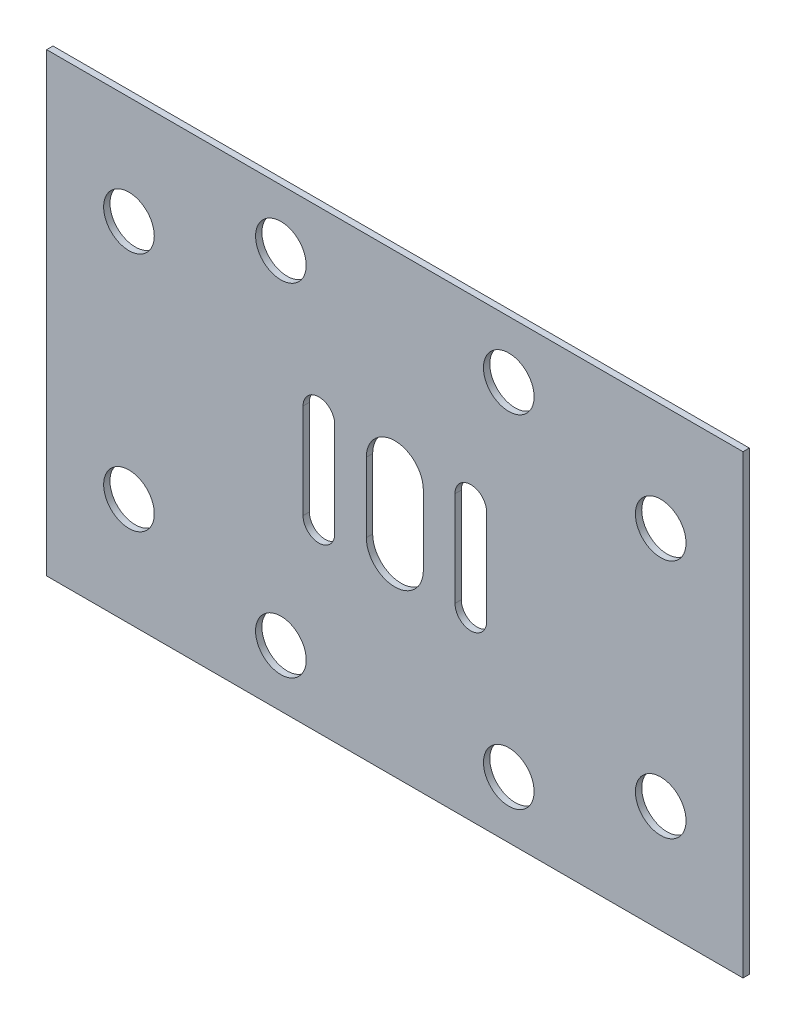
ISO-10303-21;
HEADER;
FILE_DESCRIPTION(('STEP AP214'),'2;1');
FILE_NAME('part.step','',(''),(''),'','','');
FILE_SCHEMA(('AUTOMOTIVE_DESIGN { 1 0 10303 214 1 1 1 1 }'));
ENDSEC;
DATA;
#1=APPLICATION_CONTEXT('core data for automotive mechanical design processes');
#2=APPLICATION_PROTOCOL_DEFINITION('international standard','automotive_design',2000,#1);
#3=PRODUCT_CONTEXT('',#1,'mechanical');
#4=PRODUCT('Part','Part','',(#3));
#5=PRODUCT_RELATED_PRODUCT_CATEGORY('part','',(#4));
#6=PRODUCT_DEFINITION_FORMATION('','',#4);
#7=PRODUCT_DEFINITION_CONTEXT('part definition',#1,'design');
#8=PRODUCT_DEFINITION('design','',#6,#7);
#9=PRODUCT_DEFINITION_SHAPE('','',#8);
#10=(LENGTH_UNIT() NAMED_UNIT(*) SI_UNIT(.MILLI.,.METRE.));
#11=(NAMED_UNIT(*) PLANE_ANGLE_UNIT() SI_UNIT($,.RADIAN.));
#12=(NAMED_UNIT(*) SI_UNIT($,.STERADIAN.) SOLID_ANGLE_UNIT());
#13=UNCERTAINTY_MEASURE_WITH_UNIT(LENGTH_MEASURE(1.E-05),#10,'distance_accuracy_value','');
#14=(GEOMETRIC_REPRESENTATION_CONTEXT(3) GLOBAL_UNCERTAINTY_ASSIGNED_CONTEXT((#13)) GLOBAL_UNIT_ASSIGNED_CONTEXT((#10,
#11,#12)) REPRESENTATION_CONTEXT('',''));
#15=CARTESIAN_POINT('',(0.,0.,0.));
#16=DIRECTION('',(0.,0.,1.));
#17=DIRECTION('',(1.,0.,0.));
#18=AXIS2_PLACEMENT_3D('',#15,#16,#17);
#19=CARTESIAN_POINT('',(0.,0.,0.25));
#20=DIRECTION('',(0.,0.,1.));
#21=DIRECTION('',(1.,0.,0.));
#22=AXIS2_PLACEMENT_3D('',#19,#20,#21);
#23=PLANE('',#22);
#24=CARTESIAN_POINT('',(9.,13.5,0.25));
#25=DIRECTION('',(0.,0.,1.));
#26=DIRECTION('',(-1.,0.,0.));
#27=AXIS2_PLACEMENT_3D('',#24,#25,#26);
#28=CIRCLE('',#27,2.);
#29=CARTESIAN_POINT('',(7.,13.5,0.25));
#30=VERTEX_POINT('',#29);
#31=EDGE_CURVE('E435',#30,#30,#28,.T.);
#32=ORIENTED_EDGE('',*,*,#31,.F.);
#33=EDGE_LOOP('',(#32));
#34=FACE_BOUND('',#33,.T.);
#35=CARTESIAN_POINT('',(9.,-13.5,0.25));
#36=DIRECTION('',(0.,0.,1.));
#37=DIRECTION('',(1.,0.,0.));
#38=AXIS2_PLACEMENT_3D('',#35,#36,#37);
#39=CIRCLE('',#38,2.);
#40=CARTESIAN_POINT('',(11.,-13.5,0.25));
#41=VERTEX_POINT('',#40);
#42=EDGE_CURVE('E175',#41,#41,#39,.T.);
#43=ORIENTED_EDGE('',*,*,#42,.F.);
#44=EDGE_LOOP('',(#43));
#45=FACE_BOUND('',#44,.T.);
#46=CARTESIAN_POINT('',(-9.,-13.5,0.25));
#47=DIRECTION('',(0.,0.,1.));
#48=DIRECTION('',(-1.,0.,0.));
#49=AXIS2_PLACEMENT_3D('',#46,#47,#48);
#50=CIRCLE('',#49,2.);
#51=CARTESIAN_POINT('',(-11.,-13.5,0.25));
#52=VERTEX_POINT('',#51);
#53=EDGE_CURVE('E253',#52,#52,#50,.T.);
#54=ORIENTED_EDGE('',*,*,#53,.F.);
#55=EDGE_LOOP('',(#54));
#56=FACE_BOUND('',#55,.T.);
#57=CARTESIAN_POINT('',(-9.,13.5,0.25));
#58=DIRECTION('',(0.,0.,1.));
#59=DIRECTION('',(1.,0.,0.));
#60=AXIS2_PLACEMENT_3D('',#57,#58,#59);
#61=CIRCLE('',#60,2.);
#62=CARTESIAN_POINT('',(-7.,13.5,0.25));
#63=VERTEX_POINT('',#62);
#64=EDGE_CURVE('E265',#63,#63,#61,.T.);
#65=ORIENTED_EDGE('',*,*,#64,.F.);
#66=EDGE_LOOP('',(#65));
#67=FACE_BOUND('',#66,.T.);
#68=DIRECTION('',(0.,1.,0.));
#69=VECTOR('',#68,1.);
#70=CARTESIAN_POINT('',(27.5,18.,0.25));
#71=LINE('',#70,#69);
#72=CARTESIAN_POINT('',(27.5,-18.,0.25));
#73=VERTEX_POINT('',#72);
#74=CARTESIAN_POINT('',(27.5,18.,0.25));
#75=VERTEX_POINT('',#74);
#76=EDGE_CURVE('E271',#73,#75,#71,.T.);
#77=ORIENTED_EDGE('',*,*,#76,.T.);
#78=DIRECTION('',(-1.,0.,0.));
#79=VECTOR('',#78,1.);
#80=CARTESIAN_POINT('',(-27.5,18.,0.25));
#81=LINE('',#80,#79);
#82=CARTESIAN_POINT('',(-27.5,18.,0.25));
#83=VERTEX_POINT('',#82);
#84=EDGE_CURVE('E274',#75,#83,#81,.T.);
#85=ORIENTED_EDGE('',*,*,#84,.T.);
#86=DIRECTION('',(0.,-1.,0.));
#87=VECTOR('',#86,1.);
#88=CARTESIAN_POINT('',(-27.5,18.,0.25));
#89=LINE('',#88,#87);
#90=CARTESIAN_POINT('',(-27.5,-18.,0.25));
#91=VERTEX_POINT('',#90);
#92=EDGE_CURVE('E277',#83,#91,#89,.T.);
#93=ORIENTED_EDGE('',*,*,#92,.T.);
#94=DIRECTION('',(1.,0.,0.));
#95=VECTOR('',#94,1.);
#96=CARTESIAN_POINT('',(-27.5,-18.,0.25));
#97=LINE('',#96,#95);
#98=EDGE_CURVE('E279',#91,#73,#97,.T.);
#99=ORIENTED_EDGE('',*,*,#98,.T.);
#100=EDGE_LOOP('',(#77,#85,#93,#99));
#101=FACE_BOUND('',#100,.T.);
#102=CARTESIAN_POINT('',(-21.,9.5,0.25));
#103=DIRECTION('',(0.,0.,1.));
#104=DIRECTION('',(1.,0.,0.));
#105=AXIS2_PLACEMENT_3D('',#102,#103,#104);
#106=CIRCLE('',#105,2.);
#107=CARTESIAN_POINT('',(-19.,9.5,0.25));
#108=VERTEX_POINT('',#107);
#109=EDGE_CURVE('E259',#108,#108,#106,.T.);
#110=ORIENTED_EDGE('',*,*,#109,.F.);
#111=EDGE_LOOP('',(#110));
#112=FACE_BOUND('',#111,.T.);
#113=CARTESIAN_POINT('',(-21.,-9.5,0.25));
#114=DIRECTION('',(0.,0.,1.));
#115=DIRECTION('',(-1.,0.,0.));
#116=AXIS2_PLACEMENT_3D('',#113,#114,#115);
#117=CIRCLE('',#116,2.);
#118=CARTESIAN_POINT('',(-23.,-9.5,0.25));
#119=VERTEX_POINT('',#118);
#120=EDGE_CURVE('E247',#119,#119,#117,.T.);
#121=ORIENTED_EDGE('',*,*,#120,.F.);
#122=EDGE_LOOP('',(#121));
#123=FACE_BOUND('',#122,.T.);
#124=DIRECTION('',(0.,-1.,0.));
#125=VECTOR('',#124,1.);
#126=CARTESIAN_POINT('',(-2.25,2.75,0.25));
#127=LINE('',#126,#125);
#128=CARTESIAN_POINT('',(-2.25,2.75,0.25));
#129=VERTEX_POINT('',#128);
#130=CARTESIAN_POINT('',(-2.25,-2.75,0.25));
#131=VERTEX_POINT('',#130);
#132=EDGE_CURVE('E218',#129,#131,#127,.T.);
#133=ORIENTED_EDGE('',*,*,#132,.F.);
#134=CARTESIAN_POINT('',(0.,2.75,0.25));
#135=DIRECTION('',(0.,0.,1.));
#136=DIRECTION('',(1.,0.,0.));
#137=AXIS2_PLACEMENT_3D('',#134,#135,#136);
#138=CIRCLE('',#137,2.25);
#139=CARTESIAN_POINT('',(2.25,2.75,0.25));
#140=VERTEX_POINT('',#139);
#141=EDGE_CURVE('E216',#140,#129,#138,.T.);
#142=ORIENTED_EDGE('',*,*,#141,.F.);
#143=DIRECTION('',(0.,1.,0.));
#144=VECTOR('',#143,1.);
#145=CARTESIAN_POINT('',(2.25,2.75,0.25));
#146=LINE('',#145,#144);
#147=CARTESIAN_POINT('',(2.25,-2.75,0.25));
#148=VERTEX_POINT('',#147);
#149=EDGE_CURVE('E224',#148,#140,#146,.T.);
#150=ORIENTED_EDGE('',*,*,#149,.F.);
#151=CARTESIAN_POINT('',(0.,-2.75,0.25));
#152=DIRECTION('',(0.,0.,1.));
#153=DIRECTION('',(1.,0.,0.));
#154=AXIS2_PLACEMENT_3D('',#151,#152,#153);
#155=CIRCLE('',#154,2.25);
#156=EDGE_CURVE('E221',#131,#148,#155,.T.);
#157=ORIENTED_EDGE('',*,*,#156,.F.);
#158=EDGE_LOOP('',(#133,#142,#150,#157));
#159=FACE_BOUND('',#158,.T.);
#160=DIRECTION('',(0.,-1.,0.));
#161=VECTOR('',#160,1.);
#162=CARTESIAN_POINT('',(-7.25,3.75,0.25));
#163=LINE('',#162,#161);
#164=CARTESIAN_POINT('',(-7.25,3.75,0.25));
#165=VERTEX_POINT('',#164);
#166=CARTESIAN_POINT('',(-7.25,-3.75000000000001,0.25));
#167=VERTEX_POINT('',#166);
#168=EDGE_CURVE('E187',#165,#167,#163,.T.);
#169=ORIENTED_EDGE('',*,*,#168,.F.);
#170=CARTESIAN_POINT('',(-6.,3.75,0.25));
#171=DIRECTION('',(0.,0.,1.));
#172=DIRECTION('',(1.,0.,0.));
#173=AXIS2_PLACEMENT_3D('',#170,#171,#172);
#174=CIRCLE('',#173,1.25);
#175=CARTESIAN_POINT('',(-4.75,3.75,0.25));
#176=VERTEX_POINT('',#175);
#177=EDGE_CURVE('E185',#176,#165,#174,.T.);
#178=ORIENTED_EDGE('',*,*,#177,.F.);
#179=DIRECTION('',(0.,1.,0.));
#180=VECTOR('',#179,1.);
#181=CARTESIAN_POINT('',(-4.75,3.75,0.25));
#182=LINE('',#181,#180);
#183=CARTESIAN_POINT('',(-4.75,-3.75000000000001,0.25));
#184=VERTEX_POINT('',#183);
#185=EDGE_CURVE('E193',#184,#176,#182,.T.);
#186=ORIENTED_EDGE('',*,*,#185,.F.);
#187=CARTESIAN_POINT('',(-6.,-3.75000000000001,0.25));
#188=DIRECTION('',(0.,0.,1.));
#189=DIRECTION('',(1.,0.,0.));
#190=AXIS2_PLACEMENT_3D('',#187,#188,#189);
#191=CIRCLE('',#190,1.25);
#192=EDGE_CURVE('E190',#167,#184,#191,.T.);
#193=ORIENTED_EDGE('',*,*,#192,.F.);
#194=EDGE_LOOP('',(#169,#178,#186,#193));
#195=FACE_BOUND('',#194,.T.);
#196=DIRECTION('',(0.,-1.,0.));
#197=VECTOR('',#196,1.);
#198=CARTESIAN_POINT('',(4.75,3.75,0.25));
#199=LINE('',#198,#197);
#200=CARTESIAN_POINT('',(4.75,3.75,0.25));
#201=VERTEX_POINT('',#200);
#202=CARTESIAN_POINT('',(4.75,-3.75000000000001,0.25));
#203=VERTEX_POINT('',#202);
#204=EDGE_CURVE('E154',#201,#203,#199,.T.);
#205=ORIENTED_EDGE('',*,*,#204,.F.);
#206=CARTESIAN_POINT('',(6.,3.75,0.25));
#207=DIRECTION('',(0.,0.,1.));
#208=DIRECTION('',(-1.,0.,0.));
#209=AXIS2_PLACEMENT_3D('',#206,#207,#208);
#210=CIRCLE('',#209,1.25);
#211=CARTESIAN_POINT('',(7.25,3.75,0.25));
#212=VERTEX_POINT('',#211);
#213=EDGE_CURVE('E146',#212,#201,#210,.T.);
#214=ORIENTED_EDGE('',*,*,#213,.F.);
#215=DIRECTION('',(0.,1.,0.));
#216=VECTOR('',#215,1.);
#217=CARTESIAN_POINT('',(7.25,3.75,0.25));
#218=LINE('',#217,#216);
#219=CARTESIAN_POINT('',(7.25,-3.75000000000001,0.25));
#220=VERTEX_POINT('',#219);
#221=EDGE_CURVE('E169',#220,#212,#218,.T.);
#222=ORIENTED_EDGE('',*,*,#221,.F.);
#223=CARTESIAN_POINT('',(6.,-3.75000000000001,0.25));
#224=DIRECTION('',(0.,0.,1.));
#225=DIRECTION('',(-1.,0.,0.));
#226=AXIS2_PLACEMENT_3D('',#223,#224,#225);
#227=CIRCLE('',#226,1.25);
#228=EDGE_CURVE('E167',#203,#220,#227,.T.);
#229=ORIENTED_EDGE('',*,*,#228,.F.);
#230=EDGE_LOOP('',(#205,#214,#222,#229));
#231=FACE_BOUND('',#230,.T.);
#232=CARTESIAN_POINT('',(21.,-9.5,0.25));
#233=DIRECTION('',(0.,0.,1.));
#234=DIRECTION('',(1.,0.,0.));
#235=AXIS2_PLACEMENT_3D('',#232,#233,#234);
#236=CIRCLE('',#235,2.);
#237=CARTESIAN_POINT('',(23.,-9.5,0.25));
#238=VERTEX_POINT('',#237);
#239=EDGE_CURVE('E441',#238,#238,#236,.T.);
#240=ORIENTED_EDGE('',*,*,#239,.F.);
#241=EDGE_LOOP('',(#240));
#242=FACE_BOUND('',#241,.T.);
#243=CARTESIAN_POINT('',(21.,9.5,0.25));
#244=DIRECTION('',(0.,0.,1.));
#245=DIRECTION('',(-1.,0.,0.));
#246=AXIS2_PLACEMENT_3D('',#243,#244,#245);
#247=CIRCLE('',#246,2.);
#248=CARTESIAN_POINT('',(19.,9.5,0.25));
#249=VERTEX_POINT('',#248);
#250=EDGE_CURVE('E426',#249,#249,#247,.T.);
#251=ORIENTED_EDGE('',*,*,#250,.F.);
#252=EDGE_LOOP('',(#251));
#253=FACE_BOUND('',#252,.T.);
#254=ADVANCED_FACE('F33',(#34,#45,#56,#67,#101,#112,#123,#159,#195,#231,#242,#253),#23,.T.);
#255=CARTESIAN_POINT('',(0.,0.,-0.25));
#256=DIRECTION('',(0.,0.,1.));
#257=DIRECTION('',(1.,0.,0.));
#258=AXIS2_PLACEMENT_3D('',#255,#256,#257);
#259=PLANE('',#258);
#260=CARTESIAN_POINT('',(-6.,3.75,-0.25));
#261=DIRECTION('',(0.,0.,1.));
#262=DIRECTION('',(1.,0.,0.));
#263=AXIS2_PLACEMENT_3D('',#260,#261,#262);
#264=CIRCLE('',#263,1.25);
#265=CARTESIAN_POINT('',(-4.75,3.75,-0.25));
#266=VERTEX_POINT('',#265);
#267=CARTESIAN_POINT('',(-7.25,3.75,-0.25));
#268=VERTEX_POINT('',#267);
#269=EDGE_CURVE('E162',#266,#268,#264,.T.);
#270=ORIENTED_EDGE('',*,*,#269,.T.);
#271=DIRECTION('',(0.,-1.,0.));
#272=VECTOR('',#271,1.);
#273=CARTESIAN_POINT('',(-7.25,3.75,-0.25));
#274=LINE('',#273,#272);
#275=CARTESIAN_POINT('',(-7.25,-3.75000000000001,-0.25));
#276=VERTEX_POINT('',#275);
#277=EDGE_CURVE('E198',#268,#276,#274,.T.);
#278=ORIENTED_EDGE('',*,*,#277,.T.);
#279=CARTESIAN_POINT('',(-6.,-3.75000000000001,-0.25));
#280=DIRECTION('',(0.,0.,1.));
#281=DIRECTION('',(1.,0.,0.));
#282=AXIS2_PLACEMENT_3D('',#279,#280,#281);
#283=CIRCLE('',#282,1.25);
#284=CARTESIAN_POINT('',(-4.75,-3.75000000000001,-0.25));
#285=VERTEX_POINT('',#284);
#286=EDGE_CURVE('E201',#276,#285,#283,.T.);
#287=ORIENTED_EDGE('',*,*,#286,.T.);
#288=DIRECTION('',(0.,1.,0.));
#289=VECTOR('',#288,1.);
#290=CARTESIAN_POINT('',(-4.75,3.75,-0.25));
#291=LINE('',#290,#289);
#292=EDGE_CURVE('E188',#285,#266,#291,.T.);
#293=ORIENTED_EDGE('',*,*,#292,.T.);
#294=EDGE_LOOP('',(#270,#278,#287,#293));
#295=FACE_BOUND('',#294,.T.);
#296=CARTESIAN_POINT('',(-21.,-9.5,-0.25));
#297=DIRECTION('',(0.,0.,1.));
#298=DIRECTION('',(-1.,0.,0.));
#299=AXIS2_PLACEMENT_3D('',#296,#297,#298);
#300=CIRCLE('',#299,2.);
#301=CARTESIAN_POINT('',(-23.,-9.5,-0.25));
#302=VERTEX_POINT('',#301);
#303=EDGE_CURVE('E246',#302,#302,#300,.T.);
#304=ORIENTED_EDGE('',*,*,#303,.T.);
#305=EDGE_LOOP('',(#304));
#306=FACE_BOUND('',#305,.T.);
#307=CARTESIAN_POINT('',(-9.,-13.5,-0.25));
#308=DIRECTION('',(0.,0.,1.));
#309=DIRECTION('',(-1.,0.,0.));
#310=AXIS2_PLACEMENT_3D('',#307,#308,#309);
#311=CIRCLE('',#310,2.);
#312=CARTESIAN_POINT('',(-11.,-13.5,-0.25));
#313=VERTEX_POINT('',#312);
#314=EDGE_CURVE('E250',#313,#313,#311,.T.);
#315=ORIENTED_EDGE('',*,*,#314,.T.);
#316=EDGE_LOOP('',(#315));
#317=FACE_BOUND('',#316,.T.);
#318=CARTESIAN_POINT('',(-21.,9.5,-0.25));
#319=DIRECTION('',(0.,0.,1.));
#320=DIRECTION('',(1.,0.,0.));
#321=AXIS2_PLACEMENT_3D('',#318,#319,#320);
#322=CIRCLE('',#321,2.);
#323=CARTESIAN_POINT('',(-19.,9.5,-0.25));
#324=VERTEX_POINT('',#323);
#325=EDGE_CURVE('E256',#324,#324,#322,.T.);
#326=ORIENTED_EDGE('',*,*,#325,.T.);
#327=EDGE_LOOP('',(#326));
#328=FACE_BOUND('',#327,.T.);
#329=CARTESIAN_POINT('',(-9.,13.5,-0.25));
#330=DIRECTION('',(0.,0.,1.));
#331=DIRECTION('',(1.,0.,0.));
#332=AXIS2_PLACEMENT_3D('',#329,#330,#331);
#333=CIRCLE('',#332,2.);
#334=CARTESIAN_POINT('',(-7.,13.5,-0.25));
#335=VERTEX_POINT('',#334);
#336=EDGE_CURVE('E262',#335,#335,#333,.T.);
#337=ORIENTED_EDGE('',*,*,#336,.T.);
#338=EDGE_LOOP('',(#337));
#339=FACE_BOUND('',#338,.T.);
#340=DIRECTION('',(0.,1.,0.));
#341=VECTOR('',#340,1.);
#342=CARTESIAN_POINT('',(27.5,18.,-0.25));
#343=LINE('',#342,#341);
#344=CARTESIAN_POINT('',(27.5,-18.,-0.25));
#345=VERTEX_POINT('',#344);
#346=CARTESIAN_POINT('',(27.5,18.,-0.25));
#347=VERTEX_POINT('',#346);
#348=EDGE_CURVE('E268',#345,#347,#343,.T.);
#349=ORIENTED_EDGE('',*,*,#348,.F.);
#350=DIRECTION('',(1.,0.,0.));
#351=VECTOR('',#350,1.);
#352=CARTESIAN_POINT('',(-27.5,-18.,-0.25));
#353=LINE('',#352,#351);
#354=CARTESIAN_POINT('',(-27.5,-18.,-0.25));
#355=VERTEX_POINT('',#354);
#356=EDGE_CURVE('E275',#355,#345,#353,.T.);
#357=ORIENTED_EDGE('',*,*,#356,.F.);
#358=DIRECTION('',(0.,-1.,0.));
#359=VECTOR('',#358,1.);
#360=CARTESIAN_POINT('',(-27.5,18.,-0.25));
#361=LINE('',#360,#359);
#362=CARTESIAN_POINT('',(-27.5,18.,-0.25));
#363=VERTEX_POINT('',#362);
#364=EDGE_CURVE('E286',#363,#355,#361,.T.);
#365=ORIENTED_EDGE('',*,*,#364,.F.);
#366=DIRECTION('',(-1.,0.,0.));
#367=VECTOR('',#366,1.);
#368=CARTESIAN_POINT('',(-27.5,18.,-0.25));
#369=LINE('',#368,#367);
#370=EDGE_CURVE('E284',#347,#363,#369,.T.);
#371=ORIENTED_EDGE('',*,*,#370,.F.);
#372=EDGE_LOOP('',(#349,#357,#365,#371));
#373=FACE_BOUND('',#372,.T.);
#374=CARTESIAN_POINT('',(0.,2.75,-0.25));
#375=DIRECTION('',(0.,0.,1.));
#376=DIRECTION('',(1.,0.,0.));
#377=AXIS2_PLACEMENT_3D('',#374,#375,#376);
#378=CIRCLE('',#377,2.25);
#379=CARTESIAN_POINT('',(2.25,2.75,-0.25));
#380=VERTEX_POINT('',#379);
#381=CARTESIAN_POINT('',(-2.25,2.75,-0.25));
#382=VERTEX_POINT('',#381);
#383=EDGE_CURVE('E215',#380,#382,#378,.T.);
#384=ORIENTED_EDGE('',*,*,#383,.T.);
#385=DIRECTION('',(0.,-1.,0.));
#386=VECTOR('',#385,1.);
#387=CARTESIAN_POINT('',(-2.25,2.75,-0.25));
#388=LINE('',#387,#386);
#389=CARTESIAN_POINT('',(-2.25,-2.75,-0.25));
#390=VERTEX_POINT('',#389);
#391=EDGE_CURVE('E229',#382,#390,#388,.T.);
#392=ORIENTED_EDGE('',*,*,#391,.T.);
#393=CARTESIAN_POINT('',(0.,-2.75,-0.25));
#394=DIRECTION('',(0.,0.,1.));
#395=DIRECTION('',(1.,0.,0.));
#396=AXIS2_PLACEMENT_3D('',#393,#394,#395);
#397=CIRCLE('',#396,2.25);
#398=CARTESIAN_POINT('',(2.25,-2.75,-0.25));
#399=VERTEX_POINT('',#398);
#400=EDGE_CURVE('E232',#390,#399,#397,.T.);
#401=ORIENTED_EDGE('',*,*,#400,.T.);
#402=DIRECTION('',(0.,1.,0.));
#403=VECTOR('',#402,1.);
#404=CARTESIAN_POINT('',(2.25,2.75,-0.25));
#405=LINE('',#404,#403);
#406=EDGE_CURVE('E219',#399,#380,#405,.T.);
#407=ORIENTED_EDGE('',*,*,#406,.T.);
#408=EDGE_LOOP('',(#384,#392,#401,#407));
#409=FACE_BOUND('',#408,.T.);
#410=CARTESIAN_POINT('',(6.,3.75,-0.25));
#411=DIRECTION('',(0.,0.,1.));
#412=DIRECTION('',(-1.,0.,0.));
#413=AXIS2_PLACEMENT_3D('',#410,#411,#412);
#414=CIRCLE('',#413,1.25);
#415=CARTESIAN_POINT('',(7.25,3.75,-0.25));
#416=VERTEX_POINT('',#415);
#417=CARTESIAN_POINT('',(4.75,3.75,-0.25));
#418=VERTEX_POINT('',#417);
#419=EDGE_CURVE('E56',#416,#418,#414,.T.);
#420=ORIENTED_EDGE('',*,*,#419,.T.);
#421=DIRECTION('',(0.,-1.,0.));
#422=VECTOR('',#421,1.);
#423=CARTESIAN_POINT('',(4.75,3.75,-0.25));
#424=LINE('',#423,#422);
#425=CARTESIAN_POINT('',(4.75,-3.75000000000001,-0.25));
#426=VERTEX_POINT('',#425);
#427=EDGE_CURVE('E161',#418,#426,#424,.T.);
#428=ORIENTED_EDGE('',*,*,#427,.T.);
#429=CARTESIAN_POINT('',(6.,-3.75000000000001,-0.25));
#430=DIRECTION('',(0.,0.,1.));
#431=DIRECTION('',(-1.,0.,0.));
#432=AXIS2_PLACEMENT_3D('',#429,#430,#431);
#433=CIRCLE('',#432,1.25);
#434=CARTESIAN_POINT('',(7.25,-3.75000000000001,-0.25));
#435=VERTEX_POINT('',#434);
#436=EDGE_CURVE('E177',#426,#435,#433,.T.);
#437=ORIENTED_EDGE('',*,*,#436,.T.);
#438=DIRECTION('',(0.,1.,0.));
#439=VECTOR('',#438,1.);
#440=CARTESIAN_POINT('',(7.25,3.75,-0.25));
#441=LINE('',#440,#439);
#442=EDGE_CURVE('E155',#435,#416,#441,.T.);
#443=ORIENTED_EDGE('',*,*,#442,.T.);
#444=EDGE_LOOP('',(#420,#428,#437,#443));
#445=FACE_BOUND('',#444,.T.);
#446=CARTESIAN_POINT('',(9.,-13.5,-0.25));
#447=DIRECTION('',(0.,0.,1.));
#448=DIRECTION('',(1.,0.,0.));
#449=AXIS2_PLACEMENT_3D('',#446,#447,#448);
#450=CIRCLE('',#449,2.);
#451=CARTESIAN_POINT('',(11.,-13.5,-0.25));
#452=VERTEX_POINT('',#451);
#453=EDGE_CURVE('E444',#452,#452,#450,.T.);
#454=ORIENTED_EDGE('',*,*,#453,.T.);
#455=EDGE_LOOP('',(#454));
#456=FACE_BOUND('',#455,.T.);
#457=CARTESIAN_POINT('',(21.,-9.5,-0.25));
#458=DIRECTION('',(0.,0.,1.));
#459=DIRECTION('',(1.,0.,0.));
#460=AXIS2_PLACEMENT_3D('',#457,#458,#459);
#461=CIRCLE('',#460,2.);
#462=CARTESIAN_POINT('',(23.,-9.5,-0.25));
#463=VERTEX_POINT('',#462);
#464=EDGE_CURVE('E438',#463,#463,#461,.T.);
#465=ORIENTED_EDGE('',*,*,#464,.T.);
#466=EDGE_LOOP('',(#465));
#467=FACE_BOUND('',#466,.T.);
#468=CARTESIAN_POINT('',(9.,13.5,-0.25));
#469=DIRECTION('',(0.,0.,1.));
#470=DIRECTION('',(-1.,0.,0.));
#471=AXIS2_PLACEMENT_3D('',#468,#469,#470);
#472=CIRCLE('',#471,2.);
#473=CARTESIAN_POINT('',(7.,13.5,-0.25));
#474=VERTEX_POINT('',#473);
#475=EDGE_CURVE('E432',#474,#474,#472,.T.);
#476=ORIENTED_EDGE('',*,*,#475,.T.);
#477=EDGE_LOOP('',(#476));
#478=FACE_BOUND('',#477,.T.);
#479=CARTESIAN_POINT('',(21.,9.5,-0.25));
#480=DIRECTION('',(0.,0.,1.));
#481=DIRECTION('',(-1.,0.,0.));
#482=AXIS2_PLACEMENT_3D('',#479,#480,#481);
#483=CIRCLE('',#482,2.);
#484=CARTESIAN_POINT('',(19.,9.5,-0.25));
#485=VERTEX_POINT('',#484);
#486=EDGE_CURVE('E429',#485,#485,#483,.T.);
#487=ORIENTED_EDGE('',*,*,#486,.T.);
#488=EDGE_LOOP('',(#487));
#489=FACE_BOUND('',#488,.T.);
#490=ADVANCED_FACE('F304',(#295,#306,#317,#328,#339,#373,#409,#445,#456,#467,#478,#489),#259,.F.);
#491=CARTESIAN_POINT('',(27.5,18.,0.25));
#492=DIRECTION('',(-1.,0.,0.));
#493=DIRECTION('',(0.,-1.,0.));
#494=AXIS2_PLACEMENT_3D('',#491,#492,#493);
#495=PLANE('',#494);
#496=ORIENTED_EDGE('',*,*,#348,.T.);
#497=DIRECTION('',(0.,0.,-1.));
#498=VECTOR('',#497,1.);
#499=CARTESIAN_POINT('',(27.5,18.,0.25));
#500=LINE('',#499,#498);
#501=EDGE_CURVE('E11',#75,#347,#500,.T.);
#502=ORIENTED_EDGE('',*,*,#501,.F.);
#503=ORIENTED_EDGE('',*,*,#76,.F.);
#504=DIRECTION('',(0.,0.,-1.));
#505=VECTOR('',#504,1.);
#506=CARTESIAN_POINT('',(27.5,-18.,0.25));
#507=LINE('',#506,#505);
#508=EDGE_CURVE('E281',#73,#345,#507,.T.);
#509=ORIENTED_EDGE('',*,*,#508,.T.);
#510=EDGE_LOOP('',(#496,#502,#503,#509));
#511=FACE_BOUND('',#510,.T.);
#512=ADVANCED_FACE('F35',(#511),#495,.F.);
#513=CARTESIAN_POINT('',(-27.5,18.,0.25));
#514=DIRECTION('',(0.,-1.,0.));
#515=DIRECTION('',(0.,0.,-1.));
#516=AXIS2_PLACEMENT_3D('',#513,#514,#515);
#517=PLANE('',#516);
#518=ORIENTED_EDGE('',*,*,#370,.T.);
#519=DIRECTION('',(0.,0.,-1.));
#520=VECTOR('',#519,1.);
#521=CARTESIAN_POINT('',(-27.5,18.,0.25));
#522=LINE('',#521,#520);
#523=EDGE_CURVE('E41',#83,#363,#522,.T.);
#524=ORIENTED_EDGE('',*,*,#523,.F.);
#525=ORIENTED_EDGE('',*,*,#84,.F.);
#526=ORIENTED_EDGE('',*,*,#501,.T.);
#527=EDGE_LOOP('',(#518,#524,#525,#526));
#528=FACE_BOUND('',#527,.T.);
#529=ADVANCED_FACE('F315',(#528),#517,.F.);
#530=CARTESIAN_POINT('',(-27.5,18.,0.25));
#531=DIRECTION('',(1.,0.,0.));
#532=DIRECTION('',(0.,1.,0.));
#533=AXIS2_PLACEMENT_3D('',#530,#531,#532);
#534=PLANE('',#533);
#535=ORIENTED_EDGE('',*,*,#364,.T.);
#536=DIRECTION('',(0.,0.,-1.));
#537=VECTOR('',#536,1.);
#538=CARTESIAN_POINT('',(-27.5,-18.,0.25));
#539=LINE('',#538,#537);
#540=EDGE_CURVE('E291',#91,#355,#539,.T.);
#541=ORIENTED_EDGE('',*,*,#540,.F.);
#542=ORIENTED_EDGE('',*,*,#92,.F.);
#543=ORIENTED_EDGE('',*,*,#523,.T.);
#544=EDGE_LOOP('',(#535,#541,#542,#543));
#545=FACE_BOUND('',#544,.T.);
#546=ADVANCED_FACE('F298',(#545),#534,.F.);
#547=CARTESIAN_POINT('',(-27.5,-18.,0.25));
#548=DIRECTION('',(0.,1.,0.));
#549=DIRECTION('',(0.,0.,1.));
#550=AXIS2_PLACEMENT_3D('',#547,#548,#549);
#551=PLANE('',#550);
#552=ORIENTED_EDGE('',*,*,#356,.T.);
#553=ORIENTED_EDGE('',*,*,#508,.F.);
#554=ORIENTED_EDGE('',*,*,#98,.F.);
#555=ORIENTED_EDGE('',*,*,#540,.T.);
#556=EDGE_LOOP('',(#552,#553,#554,#555));
#557=FACE_BOUND('',#556,.T.);
#558=ADVANCED_FACE('F308',(#557),#551,.F.);
#559=CARTESIAN_POINT('',(-9.,13.5,0.25));
#560=DIRECTION('',(0.,0.,-1.));
#561=DIRECTION('',(-1.,0.,0.));
#562=AXIS2_PLACEMENT_3D('',#559,#560,#561);
#563=CYLINDRICAL_SURFACE('',#562,2.);
#564=ORIENTED_EDGE('',*,*,#64,.T.);
#565=EDGE_LOOP('',(#564));
#566=FACE_BOUND('',#565,.T.);
#567=ORIENTED_EDGE('',*,*,#336,.F.);
#568=EDGE_LOOP('',(#567));
#569=FACE_BOUND('',#568,.T.);
#570=ADVANCED_FACE('F333',(#566,#569),#563,.F.);
#571=CARTESIAN_POINT('',(-21.,9.5,0.25));
#572=DIRECTION('',(0.,0.,-1.));
#573=DIRECTION('',(-1.,0.,0.));
#574=AXIS2_PLACEMENT_3D('',#571,#572,#573);
#575=CYLINDRICAL_SURFACE('',#574,2.);
#576=ORIENTED_EDGE('',*,*,#109,.T.);
#577=EDGE_LOOP('',(#576));
#578=FACE_BOUND('',#577,.T.);
#579=ORIENTED_EDGE('',*,*,#325,.F.);
#580=EDGE_LOOP('',(#579));
#581=FACE_BOUND('',#580,.T.);
#582=ADVANCED_FACE('F340',(#578,#581),#575,.F.);
#583=CARTESIAN_POINT('',(-9.,-13.5,0.25));
#584=DIRECTION('',(0.,0.,-1.));
#585=DIRECTION('',(-1.,0.,0.));
#586=AXIS2_PLACEMENT_3D('',#583,#584,#585);
#587=CYLINDRICAL_SURFACE('',#586,2.);
#588=ORIENTED_EDGE('',*,*,#53,.T.);
#589=EDGE_LOOP('',(#588));
#590=FACE_BOUND('',#589,.T.);
#591=ORIENTED_EDGE('',*,*,#314,.F.);
#592=EDGE_LOOP('',(#591));
#593=FACE_BOUND('',#592,.T.);
#594=ADVANCED_FACE('F345',(#590,#593),#587,.F.);
#595=CARTESIAN_POINT('',(-21.,-9.5,0.25));
#596=DIRECTION('',(0.,0.,-1.));
#597=DIRECTION('',(-1.,0.,0.));
#598=AXIS2_PLACEMENT_3D('',#595,#596,#597);
#599=CYLINDRICAL_SURFACE('',#598,2.);
#600=ORIENTED_EDGE('',*,*,#120,.T.);
#601=EDGE_LOOP('',(#600));
#602=FACE_BOUND('',#601,.T.);
#603=ORIENTED_EDGE('',*,*,#303,.F.);
#604=EDGE_LOOP('',(#603));
#605=FACE_BOUND('',#604,.T.);
#606=ADVANCED_FACE('F355',(#602,#605),#599,.F.);
#607=CARTESIAN_POINT('',(0.,2.75,0.25));
#608=DIRECTION('',(0.,0.,-1.));
#609=DIRECTION('',(-1.,0.,0.));
#610=AXIS2_PLACEMENT_3D('',#607,#608,#609);
#611=CYLINDRICAL_SURFACE('',#610,2.25);
#612=ORIENTED_EDGE('',*,*,#383,.F.);
#613=DIRECTION('',(0.,0.,-1.));
#614=VECTOR('',#613,1.);
#615=CARTESIAN_POINT('',(2.25,2.75,0.25));
#616=LINE('',#615,#614);
#617=EDGE_CURVE('E226',#140,#380,#616,.T.);
#618=ORIENTED_EDGE('',*,*,#617,.F.);
#619=ORIENTED_EDGE('',*,*,#141,.T.);
#620=DIRECTION('',(0.,0.,-1.));
#621=VECTOR('',#620,1.);
#622=CARTESIAN_POINT('',(-2.25,2.75,0.25));
#623=LINE('',#622,#621);
#624=EDGE_CURVE('E243',#129,#382,#623,.T.);
#625=ORIENTED_EDGE('',*,*,#624,.T.);
#626=EDGE_LOOP('',(#612,#618,#619,#625));
#627=FACE_BOUND('',#626,.T.);
#628=ADVANCED_FACE('F362',(#627),#611,.F.);
#629=CARTESIAN_POINT('',(-2.25,2.75,0.25));
#630=DIRECTION('',(1.,0.,0.));
#631=DIRECTION('',(0.,1.,0.));
#632=AXIS2_PLACEMENT_3D('',#629,#630,#631);
#633=PLANE('',#632);
#634=ORIENTED_EDGE('',*,*,#391,.F.);
#635=ORIENTED_EDGE('',*,*,#624,.F.);
#636=ORIENTED_EDGE('',*,*,#132,.T.);
#637=DIRECTION('',(0.,0.,-1.));
#638=VECTOR('',#637,1.);
#639=CARTESIAN_POINT('',(-2.25,-2.75,0.25));
#640=LINE('',#639,#638);
#641=EDGE_CURVE('E241',#131,#390,#640,.T.);
#642=ORIENTED_EDGE('',*,*,#641,.T.);
#643=EDGE_LOOP('',(#634,#635,#636,#642));
#644=FACE_BOUND('',#643,.T.);
#645=ADVANCED_FACE('F366',(#644),#633,.T.);
#646=CARTESIAN_POINT('',(0.,-2.75,0.25));
#647=DIRECTION('',(0.,0.,-1.));
#648=DIRECTION('',(-1.,0.,0.));
#649=AXIS2_PLACEMENT_3D('',#646,#647,#648);
#650=CYLINDRICAL_SURFACE('',#649,2.25);
#651=ORIENTED_EDGE('',*,*,#400,.F.);
#652=ORIENTED_EDGE('',*,*,#641,.F.);
#653=ORIENTED_EDGE('',*,*,#156,.T.);
#654=DIRECTION('',(0.,0.,-1.));
#655=VECTOR('',#654,1.);
#656=CARTESIAN_POINT('',(2.25,-2.75,0.25));
#657=LINE('',#656,#655);
#658=EDGE_CURVE('E239',#148,#399,#657,.T.);
#659=ORIENTED_EDGE('',*,*,#658,.T.);
#660=EDGE_LOOP('',(#651,#652,#653,#659));
#661=FACE_BOUND('',#660,.T.);
#662=ADVANCED_FACE('F370',(#661),#650,.F.);
#663=CARTESIAN_POINT('',(2.25,2.75,0.25));
#664=DIRECTION('',(-1.,0.,0.));
#665=DIRECTION('',(0.,-1.,0.));
#666=AXIS2_PLACEMENT_3D('',#663,#664,#665);
#667=PLANE('',#666);
#668=ORIENTED_EDGE('',*,*,#406,.F.);
#669=ORIENTED_EDGE('',*,*,#658,.F.);
#670=ORIENTED_EDGE('',*,*,#149,.T.);
#671=ORIENTED_EDGE('',*,*,#617,.T.);
#672=EDGE_LOOP('',(#668,#669,#670,#671));
#673=FACE_BOUND('',#672,.T.);
#674=ADVANCED_FACE('F374',(#673),#667,.T.);
#675=CARTESIAN_POINT('',(-6.,3.75,0.25));
#676=DIRECTION('',(0.,0.,-1.));
#677=DIRECTION('',(-1.,0.,0.));
#678=AXIS2_PLACEMENT_3D('',#675,#676,#677);
#679=CYLINDRICAL_SURFACE('',#678,1.25);
#680=ORIENTED_EDGE('',*,*,#269,.F.);
#681=DIRECTION('',(0.,0.,-1.));
#682=VECTOR('',#681,1.);
#683=CARTESIAN_POINT('',(-4.75,3.75,0.25));
#684=LINE('',#683,#682);
#685=EDGE_CURVE('E195',#176,#266,#684,.T.);
#686=ORIENTED_EDGE('',*,*,#685,.F.);
#687=ORIENTED_EDGE('',*,*,#177,.T.);
#688=DIRECTION('',(0.,0.,-1.));
#689=VECTOR('',#688,1.);
#690=CARTESIAN_POINT('',(-7.25,3.75,0.25));
#691=LINE('',#690,#689);
#692=EDGE_CURVE('E212',#165,#268,#691,.T.);
#693=ORIENTED_EDGE('',*,*,#692,.T.);
#694=EDGE_LOOP('',(#680,#686,#687,#693));
#695=FACE_BOUND('',#694,.T.);
#696=ADVANCED_FACE('F378',(#695),#679,.F.);
#697=CARTESIAN_POINT('',(-7.25,3.75,0.25));
#698=DIRECTION('',(1.,0.,0.));
#699=DIRECTION('',(0.,0.,-1.));
#700=AXIS2_PLACEMENT_3D('',#697,#698,#699);
#701=PLANE('',#700);
#702=ORIENTED_EDGE('',*,*,#277,.F.);
#703=ORIENTED_EDGE('',*,*,#692,.F.);
#704=ORIENTED_EDGE('',*,*,#168,.T.);
#705=DIRECTION('',(0.,0.,-1.));
#706=VECTOR('',#705,1.);
#707=CARTESIAN_POINT('',(-7.25,-3.75000000000001,0.25));
#708=LINE('',#707,#706);
#709=EDGE_CURVE('E210',#167,#276,#708,.T.);
#710=ORIENTED_EDGE('',*,*,#709,.T.);
#711=EDGE_LOOP('',(#702,#703,#704,#710));
#712=FACE_BOUND('',#711,.T.);
#713=ADVANCED_FACE('F382',(#712),#701,.T.);
#714=CARTESIAN_POINT('',(-6.,-3.75000000000001,0.25));
#715=DIRECTION('',(0.,0.,-1.));
#716=DIRECTION('',(-1.,0.,0.));
#717=AXIS2_PLACEMENT_3D('',#714,#715,#716);
#718=CYLINDRICAL_SURFACE('',#717,1.25);
#719=ORIENTED_EDGE('',*,*,#286,.F.);
#720=ORIENTED_EDGE('',*,*,#709,.F.);
#721=ORIENTED_EDGE('',*,*,#192,.T.);
#722=DIRECTION('',(0.,0.,-1.));
#723=VECTOR('',#722,1.);
#724=CARTESIAN_POINT('',(-4.75,-3.75000000000001,0.25));
#725=LINE('',#724,#723);
#726=EDGE_CURVE('E208',#184,#285,#725,.T.);
#727=ORIENTED_EDGE('',*,*,#726,.T.);
#728=EDGE_LOOP('',(#719,#720,#721,#727));
#729=FACE_BOUND('',#728,.T.);
#730=ADVANCED_FACE('F386',(#729),#718,.F.);
#731=CARTESIAN_POINT('',(-4.75,3.75,0.25));
#732=DIRECTION('',(-1.,0.,0.));
#733=DIRECTION('',(0.,-1.,0.));
#734=AXIS2_PLACEMENT_3D('',#731,#732,#733);
#735=PLANE('',#734);
#736=ORIENTED_EDGE('',*,*,#292,.F.);
#737=ORIENTED_EDGE('',*,*,#726,.F.);
#738=ORIENTED_EDGE('',*,*,#185,.T.);
#739=ORIENTED_EDGE('',*,*,#685,.T.);
#740=EDGE_LOOP('',(#736,#737,#738,#739));
#741=FACE_BOUND('',#740,.T.);
#742=ADVANCED_FACE('F390',(#741),#735,.T.);
#743=CARTESIAN_POINT('',(6.,3.75,0.25));
#744=DIRECTION('',(0.,0.,-1.));
#745=DIRECTION('',(-1.,0.,0.));
#746=AXIS2_PLACEMENT_3D('',#743,#744,#745);
#747=CYLINDRICAL_SURFACE('',#746,1.25);
#748=ORIENTED_EDGE('',*,*,#419,.F.);
#749=DIRECTION('',(0.,0.,-1.));
#750=VECTOR('',#749,1.);
#751=CARTESIAN_POINT('',(7.25,3.75,0.25));
#752=LINE('',#751,#750);
#753=EDGE_CURVE('E150',#212,#416,#752,.T.);
#754=ORIENTED_EDGE('',*,*,#753,.F.);
#755=ORIENTED_EDGE('',*,*,#213,.T.);
#756=DIRECTION('',(0.,0.,-1.));
#757=VECTOR('',#756,1.);
#758=CARTESIAN_POINT('',(4.75,3.75,0.25));
#759=LINE('',#758,#757);
#760=EDGE_CURVE('E149',#201,#418,#759,.T.);
#761=ORIENTED_EDGE('',*,*,#760,.T.);
#762=EDGE_LOOP('',(#748,#754,#755,#761));
#763=FACE_BOUND('',#762,.T.);
#764=ADVANCED_FACE('F148',(#763),#747,.F.);
#765=CARTESIAN_POINT('',(4.75,3.75,0.25));
#766=DIRECTION('',(1.,0.,0.));
#767=DIRECTION('',(0.,1.,0.));
#768=AXIS2_PLACEMENT_3D('',#765,#766,#767);
#769=PLANE('',#768);
#770=ORIENTED_EDGE('',*,*,#427,.F.);
#771=ORIENTED_EDGE('',*,*,#760,.F.);
#772=ORIENTED_EDGE('',*,*,#204,.T.);
#773=DIRECTION('',(0.,0.,-1.));
#774=VECTOR('',#773,1.);
#775=CARTESIAN_POINT('',(4.75,-3.75000000000001,0.25));
#776=LINE('',#775,#774);
#777=EDGE_CURVE('E163',#203,#426,#776,.T.);
#778=ORIENTED_EDGE('',*,*,#777,.T.);
#779=EDGE_LOOP('',(#770,#771,#772,#778));
#780=FACE_BOUND('',#779,.T.);
#781=ADVANCED_FACE('F158',(#780),#769,.T.);
#782=CARTESIAN_POINT('',(6.,-3.75000000000001,0.25));
#783=DIRECTION('',(0.,0.,-1.));
#784=DIRECTION('',(-1.,0.,0.));
#785=AXIS2_PLACEMENT_3D('',#782,#783,#784);
#786=CYLINDRICAL_SURFACE('',#785,1.25);
#787=ORIENTED_EDGE('',*,*,#436,.F.);
#788=ORIENTED_EDGE('',*,*,#777,.F.);
#789=ORIENTED_EDGE('',*,*,#228,.T.);
#790=DIRECTION('',(0.,0.,-1.));
#791=VECTOR('',#790,1.);
#792=CARTESIAN_POINT('',(7.25,-3.75000000000001,0.25));
#793=LINE('',#792,#791);
#794=EDGE_CURVE('E48',#220,#435,#793,.T.);
#795=ORIENTED_EDGE('',*,*,#794,.T.);
#796=EDGE_LOOP('',(#787,#788,#789,#795));
#797=FACE_BOUND('',#796,.T.);
#798=ADVANCED_FACE('F399',(#797),#786,.F.);
#799=CARTESIAN_POINT('',(7.25,3.75,0.25));
#800=DIRECTION('',(-1.,0.,0.));
#801=DIRECTION('',(0.,0.,1.));
#802=AXIS2_PLACEMENT_3D('',#799,#800,#801);
#803=PLANE('',#802);
#804=ORIENTED_EDGE('',*,*,#442,.F.);
#805=ORIENTED_EDGE('',*,*,#794,.F.);
#806=ORIENTED_EDGE('',*,*,#221,.T.);
#807=ORIENTED_EDGE('',*,*,#753,.T.);
#808=EDGE_LOOP('',(#804,#805,#806,#807));
#809=FACE_BOUND('',#808,.T.);
#810=ADVANCED_FACE('F402',(#809),#803,.T.);
#811=CARTESIAN_POINT('',(9.,-13.5,0.25));
#812=DIRECTION('',(0.,0.,-1.));
#813=DIRECTION('',(-1.,0.,0.));
#814=AXIS2_PLACEMENT_3D('',#811,#812,#813);
#815=CYLINDRICAL_SURFACE('',#814,2.);
#816=ORIENTED_EDGE('',*,*,#42,.T.);
#817=EDGE_LOOP('',(#816));
#818=FACE_BOUND('',#817,.T.);
#819=ORIENTED_EDGE('',*,*,#453,.F.);
#820=EDGE_LOOP('',(#819));
#821=FACE_BOUND('',#820,.T.);
#822=ADVANCED_FACE('F406',(#818,#821),#815,.F.);
#823=CARTESIAN_POINT('',(21.,-9.5,0.25));
#824=DIRECTION('',(0.,0.,-1.));
#825=DIRECTION('',(-1.,0.,0.));
#826=AXIS2_PLACEMENT_3D('',#823,#824,#825);
#827=CYLINDRICAL_SURFACE('',#826,2.);
#828=ORIENTED_EDGE('',*,*,#239,.T.);
#829=EDGE_LOOP('',(#828));
#830=FACE_BOUND('',#829,.T.);
#831=ORIENTED_EDGE('',*,*,#464,.F.);
#832=EDGE_LOOP('',(#831));
#833=FACE_BOUND('',#832,.T.);
#834=ADVANCED_FACE('F409',(#830,#833),#827,.F.);
#835=CARTESIAN_POINT('',(9.,13.5,0.25));
#836=DIRECTION('',(0.,0.,-1.));
#837=DIRECTION('',(-1.,0.,0.));
#838=AXIS2_PLACEMENT_3D('',#835,#836,#837);
#839=CYLINDRICAL_SURFACE('',#838,2.);
#840=ORIENTED_EDGE('',*,*,#31,.T.);
#841=EDGE_LOOP('',(#840));
#842=FACE_BOUND('',#841,.T.);
#843=ORIENTED_EDGE('',*,*,#475,.F.);
#844=EDGE_LOOP('',(#843));
#845=FACE_BOUND('',#844,.T.);
#846=ADVANCED_FACE('F413',(#842,#845),#839,.F.);
#847=CARTESIAN_POINT('',(21.,9.5,0.25));
#848=DIRECTION('',(0.,0.,-1.));
#849=DIRECTION('',(-1.,0.,0.));
#850=AXIS2_PLACEMENT_3D('',#847,#848,#849);
#851=CYLINDRICAL_SURFACE('',#850,2.);
#852=ORIENTED_EDGE('',*,*,#250,.T.);
#853=EDGE_LOOP('',(#852));
#854=FACE_BOUND('',#853,.T.);
#855=ORIENTED_EDGE('',*,*,#486,.F.);
#856=EDGE_LOOP('',(#855));
#857=FACE_BOUND('',#856,.T.);
#858=ADVANCED_FACE('F417',(#854,#857),#851,.F.);
#859=CLOSED_SHELL('',(#254,#490,#512,#529,#546,#558,#570,#582,#594,#606,#628,#645,#662,#674,
#696,#713,#730,#742,#764,#781,#798,#810,#822,#834,#846,#858));
#860=MANIFOLD_SOLID_BREP('B2',#859);
#861=ADVANCED_BREP_SHAPE_REPRESENTATION('',(#18,#860),#14);
#862=SHAPE_DEFINITION_REPRESENTATION(#9,#861);
ENDSEC;
END-ISO-10303-21;
